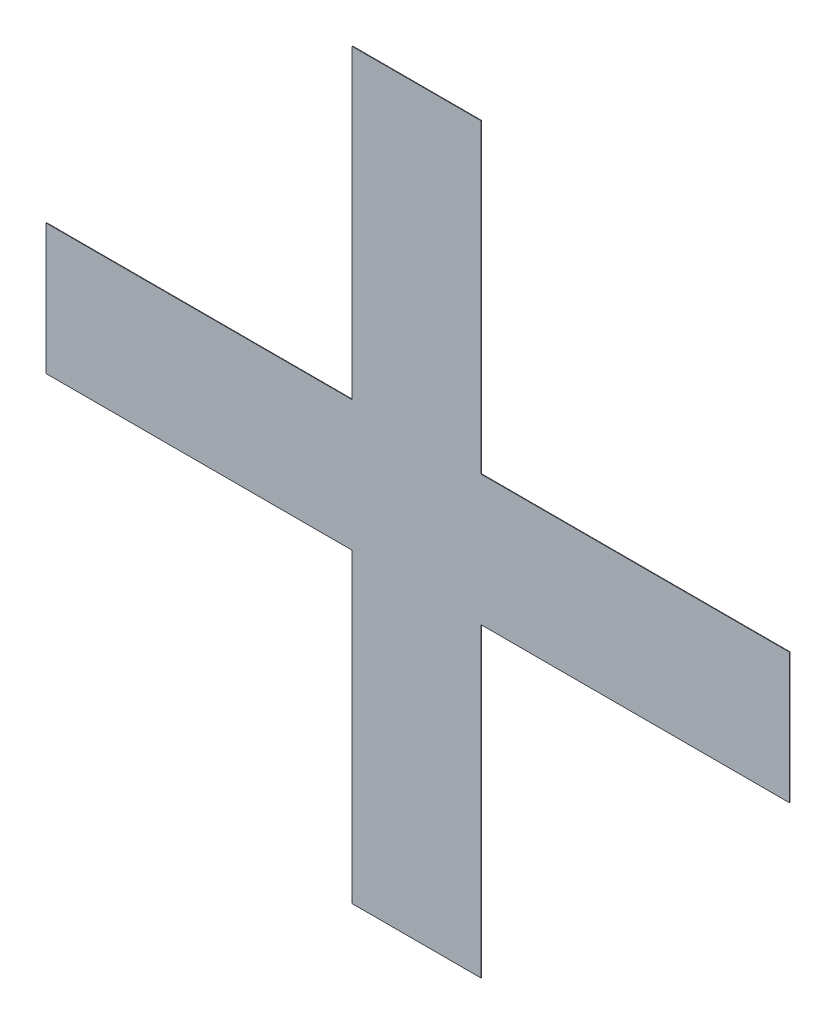
ISO-10303-21;
HEADER;
FILE_DESCRIPTION(('STEP AP214'),'2;1');
FILE_NAME('part.step','',(''),(''),'','','');
FILE_SCHEMA(('AUTOMOTIVE_DESIGN { 1 0 10303 214 1 1 1 1 }'));
ENDSEC;
DATA;
#1=APPLICATION_CONTEXT('core data for automotive mechanical design processes');
#2=APPLICATION_PROTOCOL_DEFINITION('international standard','automotive_design',2000,#1);
#3=PRODUCT_CONTEXT('',#1,'mechanical');
#4=PRODUCT('Part','Part','',(#3));
#5=PRODUCT_RELATED_PRODUCT_CATEGORY('part','',(#4));
#6=PRODUCT_DEFINITION_FORMATION('','',#4);
#7=PRODUCT_DEFINITION_CONTEXT('part definition',#1,'design');
#8=PRODUCT_DEFINITION('design','',#6,#7);
#9=PRODUCT_DEFINITION_SHAPE('','',#8);
#10=(LENGTH_UNIT() NAMED_UNIT(*) SI_UNIT(.MILLI.,.METRE.));
#11=(NAMED_UNIT(*) PLANE_ANGLE_UNIT() SI_UNIT($,.RADIAN.));
#12=(NAMED_UNIT(*) SI_UNIT($,.STERADIAN.) SOLID_ANGLE_UNIT());
#13=UNCERTAINTY_MEASURE_WITH_UNIT(LENGTH_MEASURE(1.E-05),#10,'distance_accuracy_value','');
#14=(GEOMETRIC_REPRESENTATION_CONTEXT(3) GLOBAL_UNCERTAINTY_ASSIGNED_CONTEXT((#13)) GLOBAL_UNIT_ASSIGNED_CONTEXT((#10,
#11,#12)) REPRESENTATION_CONTEXT('',''));
#15=CARTESIAN_POINT('',(0.,0.,0.));
#16=DIRECTION('',(0.,0.,1.));
#17=DIRECTION('',(1.,0.,0.));
#18=AXIS2_PLACEMENT_3D('',#15,#16,#17);
#19=CARTESIAN_POINT('',(160.256599140577,-52.9433026396562,0.002));
#20=DIRECTION('',(0.,1.,0.));
#21=DIRECTION('',(0.,0.,1.));
#22=AXIS2_PLACEMENT_3D('',#19,#20,#21);
#23=PLANE('',#22);
#24=CARTESIAN_POINT('',(160.256599140577,-52.9433026396562,0.));
#25=CARTESIAN_POINT('',(160.622194938953,-52.9433026396562,0.));
#26=CARTESIAN_POINT('',(160.98779073733,-52.9433026396562,0.));
#27=CARTESIAN_POINT('',(161.353386535707,-52.9433026396562,0.));
#28=B_SPLINE_CURVE_WITH_KNOTS('',3,(#24,#25,#26,#27),.UNSPECIFIED.,.F.,.F.,(4,4),(0.,
0.103763357596408),.UNSPECIFIED.);
#29=CARTESIAN_POINT('',(160.256599140577,-52.9433026396562,0.));
#30=VERTEX_POINT('',#29);
#31=CARTESIAN_POINT('',(161.353386535707,-52.9433026396562,0.));
#32=VERTEX_POINT('',#31);
#33=EDGE_CURVE('E113',#30,#32,#28,.T.);
#34=ORIENTED_EDGE('',*,*,#33,.T.);
#35=DIRECTION('',(0.,0.,-1.));
#36=VECTOR('',#35,1.);
#37=CARTESIAN_POINT('',(161.353386535707,-52.9433026396562,0.002));
#38=LINE('',#37,#36);
#39=CARTESIAN_POINT('',(161.353386535707,-52.9433026396562,0.002));
#40=VERTEX_POINT('',#39);
#41=EDGE_CURVE('E122',#40,#32,#38,.T.);
#42=ORIENTED_EDGE('',*,*,#41,.F.);
#43=CARTESIAN_POINT('',(160.256599140577,-52.9433026396562,0.002));
#44=CARTESIAN_POINT('',(160.622194938953,-52.9433026396562,0.002));
#45=CARTESIAN_POINT('',(160.98779073733,-52.9433026396562,0.002));
#46=CARTESIAN_POINT('',(161.353386535707,-52.9433026396562,0.002));
#47=B_SPLINE_CURVE_WITH_KNOTS('',3,(#43,#44,#45,#46),.UNSPECIFIED.,.F.,.F.,(4,4),(0.,
0.103763357596408),.UNSPECIFIED.);
#48=CARTESIAN_POINT('',(160.256599140577,-52.9433026396562,0.002));
#49=VERTEX_POINT('',#48);
#50=EDGE_CURVE('E127',#49,#40,#47,.T.);
#51=ORIENTED_EDGE('',*,*,#50,.F.);
#52=DIRECTION('',(0.,0.,-1.));
#53=VECTOR('',#52,1.);
#54=CARTESIAN_POINT('',(160.256599140577,-52.9433026396562,0.002));
#55=LINE('',#54,#53);
#56=EDGE_CURVE('E119',#49,#30,#55,.T.);
#57=ORIENTED_EDGE('',*,*,#56,.T.);
#58=EDGE_LOOP('',(#34,#42,#51,#57));
#59=FACE_BOUND('',#58,.T.);
#60=ADVANCED_FACE('F16',(#59),#23,.F.);
#61=CARTESIAN_POINT('',(161.353386535707,-52.9433026396562,0.002));
#62=DIRECTION('',(-1.,0.,0.));
#63=DIRECTION('',(0.,0.,1.));
#64=AXIS2_PLACEMENT_3D('',#61,#62,#63);
#65=PLANE('',#64);
#66=CARTESIAN_POINT('',(161.353386535707,-52.9433026396562,0.));
#67=CARTESIAN_POINT('',(161.353386535707,-52.7886065070595,0.));
#68=CARTESIAN_POINT('',(161.353386535707,-52.6339103744629,0.));
#69=CARTESIAN_POINT('',(161.353386535707,-52.4792142418662,0.));
#70=B_SPLINE_CURVE_WITH_KNOTS('',3,(#66,#67,#68,#69),.UNSPECIFIED.,.F.,.F.,(4,4),
(0.103763357596408,0.147669196221156),.UNSPECIFIED.);
#71=CARTESIAN_POINT('',(161.353386535707,-52.4792142418662,0.));
#72=VERTEX_POINT('',#71);
#73=EDGE_CURVE('E110',#32,#72,#70,.T.);
#74=ORIENTED_EDGE('',*,*,#73,.T.);
#75=DIRECTION('',(0.,0.,-1.));
#76=VECTOR('',#75,1.);
#77=CARTESIAN_POINT('',(161.353386535707,-52.4792142418662,0.002));
#78=LINE('',#77,#76);
#79=CARTESIAN_POINT('',(161.353386535707,-52.4792142418662,0.002));
#80=VERTEX_POINT('',#79);
#81=EDGE_CURVE('E118',#80,#72,#78,.T.);
#82=ORIENTED_EDGE('',*,*,#81,.F.);
#83=CARTESIAN_POINT('',(161.353386535707,-52.9433026396562,0.002));
#84=CARTESIAN_POINT('',(161.353386535707,-52.7886065070595,0.002));
#85=CARTESIAN_POINT('',(161.353386535707,-52.6339103744629,0.002));
#86=CARTESIAN_POINT('',(161.353386535707,-52.4792142418662,0.002));
#87=B_SPLINE_CURVE_WITH_KNOTS('',3,(#83,#84,#85,#86),.UNSPECIFIED.,.F.,.F.,(4,4),
(0.103763357596408,0.147669196221156),.UNSPECIFIED.);
#88=EDGE_CURVE('E104',#40,#80,#87,.T.);
#89=ORIENTED_EDGE('',*,*,#88,.F.);
#90=ORIENTED_EDGE('',*,*,#41,.T.);
#91=EDGE_LOOP('',(#74,#82,#89,#90));
#92=FACE_BOUND('',#91,.T.);
#93=ADVANCED_FACE('F123',(#92),#65,.F.);
#94=CARTESIAN_POINT('',(161.353386535707,-52.4792142418662,0.002));
#95=DIRECTION('',(0.,-1.,0.));
#96=DIRECTION('',(0.,0.,-1.));
#97=AXIS2_PLACEMENT_3D('',#94,#95,#96);
#98=PLANE('',#97);
#99=CARTESIAN_POINT('',(161.353386535707,-52.4792142418662,0.));
#100=CARTESIAN_POINT('',(160.98779073733,-52.4792142418662,0.));
#101=CARTESIAN_POINT('',(160.622194938953,-52.4792142418662,0.));
#102=CARTESIAN_POINT('',(160.256599140577,-52.4792142418662,0.));
#103=B_SPLINE_CURVE_WITH_KNOTS('',3,(#99,#100,#101,#102),.UNSPECIFIED.,.F.,.F.,(4,4),
(0.147669196221156,0.251432553817565),.UNSPECIFIED.);
#104=CARTESIAN_POINT('',(160.256599140577,-52.4792142418662,0.));
#105=VERTEX_POINT('',#104);
#106=EDGE_CURVE('E115',#72,#105,#103,.T.);
#107=ORIENTED_EDGE('',*,*,#106,.T.);
#108=DIRECTION('',(0.,0.,-1.));
#109=VECTOR('',#108,1.);
#110=CARTESIAN_POINT('',(160.256599140577,-52.4792142418662,0.002));
#111=LINE('',#110,#109);
#112=CARTESIAN_POINT('',(160.256599140577,-52.4792142418662,0.002));
#113=VERTEX_POINT('',#112);
#114=EDGE_CURVE('E174',#113,#105,#111,.T.);
#115=ORIENTED_EDGE('',*,*,#114,.F.);
#116=CARTESIAN_POINT('',(161.353386535707,-52.4792142418662,0.002));
#117=CARTESIAN_POINT('',(160.98779073733,-52.4792142418662,0.002));
#118=CARTESIAN_POINT('',(160.622194938953,-52.4792142418662,0.002));
#119=CARTESIAN_POINT('',(160.256599140577,-52.4792142418662,0.002));
#120=B_SPLINE_CURVE_WITH_KNOTS('',3,(#116,#117,#118,#119),.UNSPECIFIED.,.F.,.F.,(4,4),
(0.147669196221156,0.251432553817565),.UNSPECIFIED.);
#121=EDGE_CURVE('E178',#80,#113,#120,.T.);
#122=ORIENTED_EDGE('',*,*,#121,.F.);
#123=ORIENTED_EDGE('',*,*,#81,.T.);
#124=EDGE_LOOP('',(#107,#115,#122,#123));
#125=FACE_BOUND('',#124,.T.);
#126=ADVANCED_FACE('F439',(#125),#98,.F.);
#127=CARTESIAN_POINT('',(160.256599140577,-52.4792142418662,0.002));
#128=DIRECTION('',(-1.,0.,0.));
#129=DIRECTION('',(0.,0.,1.));
#130=AXIS2_PLACEMENT_3D('',#127,#128,#129);
#131=PLANE('',#130);
#132=CARTESIAN_POINT('',(160.256599140577,-52.4792142418662,0.));
#133=CARTESIAN_POINT('',(160.256599140577,-52.1163467703431,0.));
#134=CARTESIAN_POINT('',(160.256599140577,-51.75347929882,0.));
#135=CARTESIAN_POINT('',(160.256599140577,-51.3906118272969,0.));
#136=B_SPLINE_CURVE_WITH_KNOTS('',3,(#132,#133,#134,#135),.UNSPECIFIED.,.F.,.F.,(4,4),
(0.251432553817565,0.354421557999072),.UNSPECIFIED.);
#137=CARTESIAN_POINT('',(160.256599140577,-51.3906118272969,0.));
#138=VERTEX_POINT('',#137);
#139=EDGE_CURVE('E188',#105,#138,#136,.T.);
#140=ORIENTED_EDGE('',*,*,#139,.T.);
#141=DIRECTION('',(0.,0.,-1.));
#142=VECTOR('',#141,1.);
#143=CARTESIAN_POINT('',(160.256599140577,-51.3906118272969,0.002));
#144=LINE('',#143,#142);
#145=CARTESIAN_POINT('',(160.256599140577,-51.3906118272969,0.002));
#146=VERTEX_POINT('',#145);
#147=EDGE_CURVE('E198',#146,#138,#144,.T.);
#148=ORIENTED_EDGE('',*,*,#147,.F.);
#149=CARTESIAN_POINT('',(160.256599140577,-52.4792142418662,0.002));
#150=CARTESIAN_POINT('',(160.256599140577,-52.1163467703431,0.002));
#151=CARTESIAN_POINT('',(160.256599140577,-51.75347929882,0.002));
#152=CARTESIAN_POINT('',(160.256599140577,-51.3906118272969,0.002));
#153=B_SPLINE_CURVE_WITH_KNOTS('',3,(#149,#150,#151,#152),.UNSPECIFIED.,.F.,.F.,(4,4),
(0.251432553817565,0.354421557999072),.UNSPECIFIED.);
#154=EDGE_CURVE('E202',#113,#146,#153,.T.);
#155=ORIENTED_EDGE('',*,*,#154,.F.);
#156=ORIENTED_EDGE('',*,*,#114,.T.);
#157=EDGE_LOOP('',(#140,#148,#155,#156));
#158=FACE_BOUND('',#157,.T.);
#159=ADVANCED_FACE('F435',(#158),#131,.F.);
#160=CARTESIAN_POINT('',(160.256599140577,-51.3906118272969,0.002));
#161=DIRECTION('',(0.,-1.,0.));
#162=DIRECTION('',(0.,0.,-1.));
#163=AXIS2_PLACEMENT_3D('',#160,#161,#162);
#164=PLANE('',#163);
#165=CARTESIAN_POINT('',(160.256599140577,-51.3906118272969,0.));
#166=CARTESIAN_POINT('',(160.103812836778,-51.3906118272969,0.));
#167=CARTESIAN_POINT('',(159.951026532979,-51.3906118272969,0.));
#168=CARTESIAN_POINT('',(159.798240229179,-51.3906118272969,0.));
#169=B_SPLINE_CURVE_WITH_KNOTS('',3,(#165,#166,#167,#168),.UNSPECIFIED.,.F.,.F.,(4,4),
(0.354421557999072,0.39778534923339),.UNSPECIFIED.);
#170=CARTESIAN_POINT('',(159.798240229179,-51.3906118272969,0.));
#171=VERTEX_POINT('',#170);
#172=EDGE_CURVE('E212',#138,#171,#169,.T.);
#173=ORIENTED_EDGE('',*,*,#172,.T.);
#174=DIRECTION('',(0.,0.,-1.));
#175=VECTOR('',#174,1.);
#176=CARTESIAN_POINT('',(159.798240229179,-51.3906118272969,0.002));
#177=LINE('',#176,#175);
#178=CARTESIAN_POINT('',(159.798240229179,-51.3906118272969,0.002));
#179=VERTEX_POINT('',#178);
#180=EDGE_CURVE('E222',#179,#171,#177,.T.);
#181=ORIENTED_EDGE('',*,*,#180,.F.);
#182=CARTESIAN_POINT('',(160.256599140577,-51.3906118272969,0.002));
#183=CARTESIAN_POINT('',(160.103812836778,-51.3906118272969,0.002));
#184=CARTESIAN_POINT('',(159.951026532979,-51.3906118272969,0.002));
#185=CARTESIAN_POINT('',(159.798240229179,-51.3906118272969,0.002));
#186=B_SPLINE_CURVE_WITH_KNOTS('',3,(#182,#183,#184,#185),.UNSPECIFIED.,.F.,.F.,(4,4),
(0.354421557999072,0.39778534923339),.UNSPECIFIED.);
#187=EDGE_CURVE('E226',#146,#179,#186,.T.);
#188=ORIENTED_EDGE('',*,*,#187,.F.);
#189=ORIENTED_EDGE('',*,*,#147,.T.);
#190=EDGE_LOOP('',(#173,#181,#188,#189));
#191=FACE_BOUND('',#190,.T.);
#192=ADVANCED_FACE('F430',(#191),#164,.F.);
#193=CARTESIAN_POINT('',(159.798240229179,-51.3906118272969,0.002));
#194=DIRECTION('',(1.,0.,0.));
#195=DIRECTION('',(0.,0.,-1.));
#196=AXIS2_PLACEMENT_3D('',#193,#194,#195);
#197=PLANE('',#196);
#198=CARTESIAN_POINT('',(159.798240229179,-51.3906118272969,0.));
#199=CARTESIAN_POINT('',(159.798240229179,-51.75347929882,0.));
#200=CARTESIAN_POINT('',(159.798240229179,-52.1163467703431,0.));
#201=CARTESIAN_POINT('',(159.798240229179,-52.4792142418662,0.));
#202=B_SPLINE_CURVE_WITH_KNOTS('',3,(#198,#199,#200,#201),.UNSPECIFIED.,.F.,.F.,(4,4),
(0.39778534923339,0.500774353414899),.UNSPECIFIED.);
#203=CARTESIAN_POINT('',(159.798240229179,-52.4792142418662,0.));
#204=VERTEX_POINT('',#203);
#205=EDGE_CURVE('E236',#171,#204,#202,.T.);
#206=ORIENTED_EDGE('',*,*,#205,.T.);
#207=DIRECTION('',(0.,0.,-1.));
#208=VECTOR('',#207,1.);
#209=CARTESIAN_POINT('',(159.798240229179,-52.4792142418662,0.002));
#210=LINE('',#209,#208);
#211=CARTESIAN_POINT('',(159.798240229179,-52.4792142418662,0.002));
#212=VERTEX_POINT('',#211);
#213=EDGE_CURVE('E246',#212,#204,#210,.T.);
#214=ORIENTED_EDGE('',*,*,#213,.F.);
#215=CARTESIAN_POINT('',(159.798240229179,-51.3906118272969,0.002));
#216=CARTESIAN_POINT('',(159.798240229179,-51.75347929882,0.002));
#217=CARTESIAN_POINT('',(159.798240229179,-52.1163467703431,0.002));
#218=CARTESIAN_POINT('',(159.798240229179,-52.4792142418662,0.002));
#219=B_SPLINE_CURVE_WITH_KNOTS('',3,(#215,#216,#217,#218),.UNSPECIFIED.,.F.,.F.,(4,4),
(0.39778534923339,0.500774353414899),.UNSPECIFIED.);
#220=EDGE_CURVE('E250',#179,#212,#219,.T.);
#221=ORIENTED_EDGE('',*,*,#220,.F.);
#222=ORIENTED_EDGE('',*,*,#180,.T.);
#223=EDGE_LOOP('',(#206,#214,#221,#222));
#224=FACE_BOUND('',#223,.T.);
#225=ADVANCED_FACE('F426',(#224),#197,.F.);
#226=CARTESIAN_POINT('',(159.798240229179,-52.4792142418662,0.002));
#227=DIRECTION('',(0.,-1.,0.));
#228=DIRECTION('',(1.,0.,0.));
#229=AXIS2_PLACEMENT_3D('',#226,#227,#228);
#230=PLANE('',#229);
#231=CARTESIAN_POINT('',(159.798240229179,-52.4792142418662,0.));
#232=CARTESIAN_POINT('',(159.435372757656,-52.4792142418662,0.));
#233=CARTESIAN_POINT('',(159.072505286133,-52.4792142418662,0.));
#234=CARTESIAN_POINT('',(158.70963781461,-52.4792142418662,0.));
#235=B_SPLINE_CURVE_WITH_KNOTS('',3,(#231,#232,#233,#234),.UNSPECIFIED.,.F.,.F.,(4,4),
(0.500774353414899,0.603763357596407),.UNSPECIFIED.);
#236=CARTESIAN_POINT('',(158.70963781461,-52.4792142418662,0.));
#237=VERTEX_POINT('',#236);
#238=EDGE_CURVE('E260',#204,#237,#235,.T.);
#239=ORIENTED_EDGE('',*,*,#238,.T.);
#240=DIRECTION('',(0.,0.,-1.));
#241=VECTOR('',#240,1.);
#242=CARTESIAN_POINT('',(158.70963781461,-52.4792142418662,0.002));
#243=LINE('',#242,#241);
#244=CARTESIAN_POINT('',(158.70963781461,-52.4792142418662,0.002));
#245=VERTEX_POINT('',#244);
#246=EDGE_CURVE('E270',#245,#237,#243,.T.);
#247=ORIENTED_EDGE('',*,*,#246,.F.);
#248=CARTESIAN_POINT('',(159.798240229179,-52.4792142418662,0.002));
#249=CARTESIAN_POINT('',(159.435372757656,-52.4792142418662,0.002));
#250=CARTESIAN_POINT('',(159.072505286133,-52.4792142418662,0.002));
#251=CARTESIAN_POINT('',(158.70963781461,-52.4792142418662,0.002));
#252=B_SPLINE_CURVE_WITH_KNOTS('',3,(#248,#249,#250,#251),.UNSPECIFIED.,.F.,.F.,(4,4),
(0.500774353414899,0.603763357596407),.UNSPECIFIED.);
#253=EDGE_CURVE('E274',#212,#245,#252,.T.);
#254=ORIENTED_EDGE('',*,*,#253,.F.);
#255=ORIENTED_EDGE('',*,*,#213,.T.);
#256=EDGE_LOOP('',(#239,#247,#254,#255));
#257=FACE_BOUND('',#256,.T.);
#258=ADVANCED_FACE('F422',(#257),#230,.F.);
#259=CARTESIAN_POINT('',(158.70963781461,-52.4792142418662,0.002));
#260=DIRECTION('',(1.,0.,0.));
#261=DIRECTION('',(0.,0.,-1.));
#262=AXIS2_PLACEMENT_3D('',#259,#260,#261);
#263=PLANE('',#262);
#264=CARTESIAN_POINT('',(158.70963781461,-52.4792142418662,0.));
#265=CARTESIAN_POINT('',(158.70963781461,-52.6339103744629,0.));
#266=CARTESIAN_POINT('',(158.70963781461,-52.7886065070595,0.));
#267=CARTESIAN_POINT('',(158.70963781461,-52.9433026396562,0.));
#268=B_SPLINE_CURVE_WITH_KNOTS('',3,(#264,#265,#266,#267),.UNSPECIFIED.,.F.,.F.,(4,4),
(0.603763357596407,0.647669196221155),.UNSPECIFIED.);
#269=CARTESIAN_POINT('',(158.70963781461,-52.9433026396562,0.));
#270=VERTEX_POINT('',#269);
#271=EDGE_CURVE('E284',#237,#270,#268,.T.);
#272=ORIENTED_EDGE('',*,*,#271,.T.);
#273=DIRECTION('',(0.,0.,-1.));
#274=VECTOR('',#273,1.);
#275=CARTESIAN_POINT('',(158.70963781461,-52.9433026396562,0.002));
#276=LINE('',#275,#274);
#277=CARTESIAN_POINT('',(158.70963781461,-52.9433026396562,0.002));
#278=VERTEX_POINT('',#277);
#279=EDGE_CURVE('E294',#278,#270,#276,.T.);
#280=ORIENTED_EDGE('',*,*,#279,.F.);
#281=CARTESIAN_POINT('',(158.70963781461,-52.4792142418662,0.002));
#282=CARTESIAN_POINT('',(158.70963781461,-52.6339103744629,0.002));
#283=CARTESIAN_POINT('',(158.70963781461,-52.7886065070595,0.002));
#284=CARTESIAN_POINT('',(158.70963781461,-52.9433026396562,0.002));
#285=B_SPLINE_CURVE_WITH_KNOTS('',3,(#281,#282,#283,#284),.UNSPECIFIED.,.F.,.F.,(4,4),
(0.603763357596407,0.647669196221155),.UNSPECIFIED.);
#286=EDGE_CURVE('E298',#245,#278,#285,.T.);
#287=ORIENTED_EDGE('',*,*,#286,.F.);
#288=ORIENTED_EDGE('',*,*,#246,.T.);
#289=EDGE_LOOP('',(#272,#280,#287,#288));
#290=FACE_BOUND('',#289,.T.);
#291=ADVANCED_FACE('F417',(#290),#263,.F.);
#292=CARTESIAN_POINT('',(158.70963781461,-52.9433026396562,0.002));
#293=DIRECTION('',(0.,1.,0.));
#294=DIRECTION('',(0.,0.,1.));
#295=AXIS2_PLACEMENT_3D('',#292,#293,#294);
#296=PLANE('',#295);
#297=CARTESIAN_POINT('',(158.70963781461,-52.9433026396562,0.));
#298=CARTESIAN_POINT('',(159.072505286133,-52.9433026396562,0.));
#299=CARTESIAN_POINT('',(159.435372757656,-52.9433026396562,0.));
#300=CARTESIAN_POINT('',(159.798240229179,-52.9433026396562,0.));
#301=B_SPLINE_CURVE_WITH_KNOTS('',3,(#297,#298,#299,#300),.UNSPECIFIED.,.F.,.F.,(4,4),
(0.647669196221155,0.750658200402663),.UNSPECIFIED.);
#302=CARTESIAN_POINT('',(159.798240229179,-52.9433026396562,0.));
#303=VERTEX_POINT('',#302);
#304=EDGE_CURVE('E308',#270,#303,#301,.T.);
#305=ORIENTED_EDGE('',*,*,#304,.T.);
#306=DIRECTION('',(0.,0.,-1.));
#307=VECTOR('',#306,1.);
#308=CARTESIAN_POINT('',(159.798240229179,-52.9433026396562,0.002));
#309=LINE('',#308,#307);
#310=CARTESIAN_POINT('',(159.798240229179,-52.9433026396562,0.002));
#311=VERTEX_POINT('',#310);
#312=EDGE_CURVE('E318',#311,#303,#309,.T.);
#313=ORIENTED_EDGE('',*,*,#312,.F.);
#314=CARTESIAN_POINT('',(158.70963781461,-52.9433026396562,0.002));
#315=CARTESIAN_POINT('',(159.072505286133,-52.9433026396562,0.002));
#316=CARTESIAN_POINT('',(159.435372757656,-52.9433026396562,0.002));
#317=CARTESIAN_POINT('',(159.798240229179,-52.9433026396562,0.002));
#318=B_SPLINE_CURVE_WITH_KNOTS('',3,(#314,#315,#316,#317),.UNSPECIFIED.,.F.,.F.,(4,4),
(0.647669196221155,0.750658200402663),.UNSPECIFIED.);
#319=EDGE_CURVE('E322',#278,#311,#318,.T.);
#320=ORIENTED_EDGE('',*,*,#319,.F.);
#321=ORIENTED_EDGE('',*,*,#279,.T.);
#322=EDGE_LOOP('',(#305,#313,#320,#321));
#323=FACE_BOUND('',#322,.T.);
#324=ADVANCED_FACE('F411',(#323),#296,.F.);
#325=CARTESIAN_POINT('',(159.798240229179,-52.9433026396562,0.002));
#326=DIRECTION('',(1.,0.,0.));
#327=DIRECTION('',(0.,1.,0.));
#328=AXIS2_PLACEMENT_3D('',#325,#326,#327);
#329=PLANE('',#328);
#330=CARTESIAN_POINT('',(159.798240229179,-52.9433026396562,0.));
#331=CARTESIAN_POINT('',(159.798240229179,-53.3061701111793,0.));
#332=CARTESIAN_POINT('',(159.798240229179,-53.6690375827024,0.));
#333=CARTESIAN_POINT('',(159.798240229179,-54.0319050542255,0.));
#334=B_SPLINE_CURVE_WITH_KNOTS('',3,(#330,#331,#332,#333),.UNSPECIFIED.,.F.,.F.,(4,4),
(0.750658200402663,0.853647204584172),.UNSPECIFIED.);
#335=CARTESIAN_POINT('',(159.798240229179,-54.0319050542255,0.));
#336=VERTEX_POINT('',#335);
#337=EDGE_CURVE('E332',#303,#336,#334,.T.);
#338=ORIENTED_EDGE('',*,*,#337,.T.);
#339=DIRECTION('',(0.,0.,-1.));
#340=VECTOR('',#339,1.);
#341=CARTESIAN_POINT('',(159.798240229179,-54.0319050542255,0.002));
#342=LINE('',#341,#340);
#343=CARTESIAN_POINT('',(159.798240229179,-54.0319050542255,0.002));
#344=VERTEX_POINT('',#343);
#345=EDGE_CURVE('E342',#344,#336,#342,.T.);
#346=ORIENTED_EDGE('',*,*,#345,.F.);
#347=CARTESIAN_POINT('',(159.798240229179,-52.9433026396562,0.002));
#348=CARTESIAN_POINT('',(159.798240229179,-53.3061701111793,0.002));
#349=CARTESIAN_POINT('',(159.798240229179,-53.6690375827024,0.002));
#350=CARTESIAN_POINT('',(159.798240229179,-54.0319050542255,0.002));
#351=B_SPLINE_CURVE_WITH_KNOTS('',3,(#347,#348,#349,#350),.UNSPECIFIED.,.F.,.F.,(4,4),
(0.750658200402663,0.853647204584172),.UNSPECIFIED.);
#352=EDGE_CURVE('E346',#311,#344,#351,.T.);
#353=ORIENTED_EDGE('',*,*,#352,.F.);
#354=ORIENTED_EDGE('',*,*,#312,.T.);
#355=EDGE_LOOP('',(#338,#346,#353,#354));
#356=FACE_BOUND('',#355,.T.);
#357=ADVANCED_FACE('F407',(#356),#329,.F.);
#358=CARTESIAN_POINT('',(159.798240229179,-54.0319050542255,0.002));
#359=DIRECTION('',(0.,1.,0.));
#360=DIRECTION('',(0.,0.,1.));
#361=AXIS2_PLACEMENT_3D('',#358,#359,#360);
#362=PLANE('',#361);
#363=CARTESIAN_POINT('',(159.798240229179,-54.0319050542255,0.));
#364=CARTESIAN_POINT('',(159.951026532979,-54.0319050542255,0.));
#365=CARTESIAN_POINT('',(160.103812836778,-54.0319050542255,0.));
#366=CARTESIAN_POINT('',(160.256599140577,-54.0319050542255,0.));
#367=B_SPLINE_CURVE_WITH_KNOTS('',3,(#363,#364,#365,#366),.UNSPECIFIED.,.F.,.F.,(4,4),
(0.853647204584172,0.897010995818492),.UNSPECIFIED.);
#368=CARTESIAN_POINT('',(160.256599140577,-54.0319050542255,0.));
#369=VERTEX_POINT('',#368);
#370=EDGE_CURVE('E356',#336,#369,#367,.T.);
#371=ORIENTED_EDGE('',*,*,#370,.T.);
#372=DIRECTION('',(0.,0.,-1.));
#373=VECTOR('',#372,1.);
#374=CARTESIAN_POINT('',(160.256599140577,-54.0319050542255,0.002));
#375=LINE('',#374,#373);
#376=CARTESIAN_POINT('',(160.256599140577,-54.0319050542255,0.002));
#377=VERTEX_POINT('',#376);
#378=EDGE_CURVE('E366',#377,#369,#375,.T.);
#379=ORIENTED_EDGE('',*,*,#378,.F.);
#380=CARTESIAN_POINT('',(159.798240229179,-54.0319050542255,0.002));
#381=CARTESIAN_POINT('',(159.951026532979,-54.0319050542255,0.002));
#382=CARTESIAN_POINT('',(160.103812836778,-54.0319050542255,0.002));
#383=CARTESIAN_POINT('',(160.256599140577,-54.0319050542255,0.002));
#384=B_SPLINE_CURVE_WITH_KNOTS('',3,(#380,#381,#382,#383),.UNSPECIFIED.,.F.,.F.,(4,4),
(0.853647204584172,0.897010995818492),.UNSPECIFIED.);
#385=EDGE_CURVE('E37',#344,#377,#384,.T.);
#386=ORIENTED_EDGE('',*,*,#385,.F.);
#387=ORIENTED_EDGE('',*,*,#345,.T.);
#388=EDGE_LOOP('',(#371,#379,#386,#387));
#389=FACE_BOUND('',#388,.T.);
#390=ADVANCED_FACE('F403',(#389),#362,.F.);
#391=CARTESIAN_POINT('',(160.256599140577,-54.0319050542255,0.002));
#392=DIRECTION('',(-1.,0.,0.));
#393=DIRECTION('',(0.,0.,1.));
#394=AXIS2_PLACEMENT_3D('',#391,#392,#393);
#395=PLANE('',#394);
#396=CARTESIAN_POINT('',(160.256599140577,-54.0319050542255,0.));
#397=CARTESIAN_POINT('',(160.256599140577,-53.6690375827024,0.));
#398=CARTESIAN_POINT('',(160.256599140577,-53.3061701111793,0.));
#399=CARTESIAN_POINT('',(160.256599140577,-52.9433026396562,0.));
#400=B_SPLINE_CURVE_WITH_KNOTS('',3,(#396,#397,#398,#399),.UNSPECIFIED.,.F.,.F.,(4,4),
(0.897010995818492,1.),.UNSPECIFIED.);
#401=EDGE_CURVE('E29',#369,#30,#400,.T.);
#402=ORIENTED_EDGE('',*,*,#401,.T.);
#403=ORIENTED_EDGE('',*,*,#56,.F.);
#404=CARTESIAN_POINT('',(160.256599140577,-54.0319050542255,0.002));
#405=CARTESIAN_POINT('',(160.256599140577,-53.6690375827024,0.002));
#406=CARTESIAN_POINT('',(160.256599140577,-53.3061701111793,0.002));
#407=CARTESIAN_POINT('',(160.256599140577,-52.9433026396562,0.002));
#408=B_SPLINE_CURVE_WITH_KNOTS('',3,(#404,#405,#406,#407),.UNSPECIFIED.,.F.,.F.,(4,4),
(0.897010995818492,1.),.UNSPECIFIED.);
#409=EDGE_CURVE('E10',#377,#49,#408,.T.);
#410=ORIENTED_EDGE('',*,*,#409,.F.);
#411=ORIENTED_EDGE('',*,*,#378,.T.);
#412=EDGE_LOOP('',(#402,#403,#410,#411));
#413=FACE_BOUND('',#412,.T.);
#414=ADVANCED_FACE('F397',(#413),#395,.F.);
#415=CARTESIAN_POINT('',(160.804992838142,-52.9433026396562,0.002));
#416=DIRECTION('',(0.,0.,-1.));
#417=DIRECTION('',(-1.,0.,0.));
#418=AXIS2_PLACEMENT_3D('',#415,#416,#417);
#419=PLANE('',#418);
#420=ORIENTED_EDGE('',*,*,#50,.T.);
#421=ORIENTED_EDGE('',*,*,#88,.T.);
#422=ORIENTED_EDGE('',*,*,#121,.T.);
#423=ORIENTED_EDGE('',*,*,#154,.T.);
#424=ORIENTED_EDGE('',*,*,#187,.T.);
#425=ORIENTED_EDGE('',*,*,#220,.T.);
#426=ORIENTED_EDGE('',*,*,#253,.T.);
#427=ORIENTED_EDGE('',*,*,#286,.T.);
#428=ORIENTED_EDGE('',*,*,#319,.T.);
#429=ORIENTED_EDGE('',*,*,#352,.T.);
#430=ORIENTED_EDGE('',*,*,#385,.T.);
#431=ORIENTED_EDGE('',*,*,#409,.T.);
#432=EDGE_LOOP('',(#420,#421,#422,#423,#424,#425,#426,#427,#428,#429,#430,#431));
#433=FACE_BOUND('',#432,.T.);
#434=ADVANCED_FACE('F440',(#433),#419,.F.);
#435=CARTESIAN_POINT('',(160.804992838142,-52.9433026396562,0.));
#436=DIRECTION('',(0.,0.,-1.));
#437=DIRECTION('',(-1.,0.,0.));
#438=AXIS2_PLACEMENT_3D('',#435,#436,#437);
#439=PLANE('',#438);
#440=ORIENTED_EDGE('',*,*,#33,.F.);
#441=ORIENTED_EDGE('',*,*,#401,.F.);
#442=ORIENTED_EDGE('',*,*,#370,.F.);
#443=ORIENTED_EDGE('',*,*,#337,.F.);
#444=ORIENTED_EDGE('',*,*,#304,.F.);
#445=ORIENTED_EDGE('',*,*,#271,.F.);
#446=ORIENTED_EDGE('',*,*,#238,.F.);
#447=ORIENTED_EDGE('',*,*,#205,.F.);
#448=ORIENTED_EDGE('',*,*,#172,.F.);
#449=ORIENTED_EDGE('',*,*,#139,.F.);
#450=ORIENTED_EDGE('',*,*,#106,.F.);
#451=ORIENTED_EDGE('',*,*,#73,.F.);
#452=EDGE_LOOP('',(#440,#441,#442,#443,#444,#445,#446,#447,#448,#449,#450,#451));
#453=FACE_BOUND('',#452,.T.);
#454=ADVANCED_FACE('F18',(#453),#439,.T.);
#455=CLOSED_SHELL('',(#60,#93,#126,#159,#192,#225,#258,#291,#324,#357,#390,#414,#434,#454));
#456=MANIFOLD_SOLID_BREP('B1',#455);
#457=ADVANCED_BREP_SHAPE_REPRESENTATION('',(#18,#456),#14);
#458=SHAPE_DEFINITION_REPRESENTATION(#9,#457);
ENDSEC;
END-ISO-10303-21;
